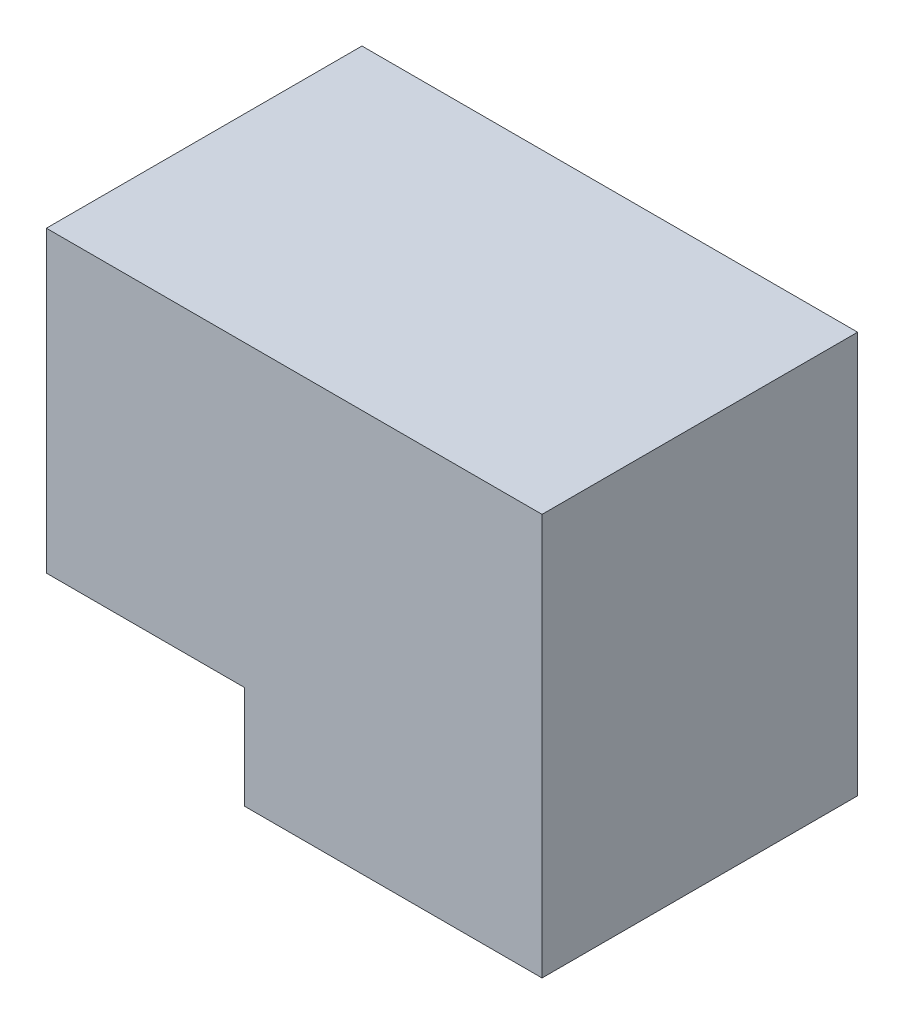
ISO-10303-21;
HEADER;
FILE_DESCRIPTION(('STEP AP214'),'2;1');
FILE_NAME('part.step','',(''),(''),'','','');
FILE_SCHEMA(('AUTOMOTIVE_DESIGN { 1 0 10303 214 1 1 1 1 }'));
ENDSEC;
DATA;
#1=APPLICATION_CONTEXT('core data for automotive mechanical design processes');
#2=APPLICATION_PROTOCOL_DEFINITION('international standard','automotive_design',2000,#1);
#3=PRODUCT_CONTEXT('',#1,'mechanical');
#4=PRODUCT('Part','Part','',(#3));
#5=PRODUCT_RELATED_PRODUCT_CATEGORY('part','',(#4));
#6=PRODUCT_DEFINITION_FORMATION('','',#4);
#7=PRODUCT_DEFINITION_CONTEXT('part definition',#1,'design');
#8=PRODUCT_DEFINITION('design','',#6,#7);
#9=PRODUCT_DEFINITION_SHAPE('','',#8);
#10=(LENGTH_UNIT() NAMED_UNIT(*) SI_UNIT(.MILLI.,.METRE.));
#11=(NAMED_UNIT(*) PLANE_ANGLE_UNIT() SI_UNIT($,.RADIAN.));
#12=(NAMED_UNIT(*) SI_UNIT($,.STERADIAN.) SOLID_ANGLE_UNIT());
#13=UNCERTAINTY_MEASURE_WITH_UNIT(LENGTH_MEASURE(1.E-05),#10,'distance_accuracy_value','');
#14=(GEOMETRIC_REPRESENTATION_CONTEXT(3) GLOBAL_UNCERTAINTY_ASSIGNED_CONTEXT((#13)) GLOBAL_UNIT_ASSIGNED_CONTEXT((#10,
#11,#12)) REPRESENTATION_CONTEXT('',''));
#15=CARTESIAN_POINT('',(0.,0.,0.));
#16=DIRECTION('',(0.,0.,1.));
#17=DIRECTION('',(1.,0.,0.));
#18=AXIS2_PLACEMENT_3D('',#15,#16,#17);
#19=CARTESIAN_POINT('',(0.,28.4005429039134,30.));
#20=DIRECTION('',(1.,0.,0.));
#21=DIRECTION('',(0.,0.,-1.));
#22=AXIS2_PLACEMENT_3D('',#19,#20,#21);
#23=PLANE('',#22);
#24=DIRECTION('',(0.,-1.,0.));
#25=VECTOR('',#24,1.);
#26=CARTESIAN_POINT('',(0.,28.4005429039134,0.));
#27=LINE('',#26,#25);
#28=CARTESIAN_POINT('',(0.,28.4005429039134,0.));
#29=VERTEX_POINT('',#28);
#30=CARTESIAN_POINT('',(0.,0.,0.));
#31=VERTEX_POINT('',#30);
#32=EDGE_CURVE('E117',#29,#31,#27,.T.);
#33=ORIENTED_EDGE('',*,*,#32,.T.);
#34=DIRECTION('',(0.,0.,-1.));
#35=VECTOR('',#34,1.);
#36=CARTESIAN_POINT('',(0.,0.,30.));
#37=LINE('',#36,#35);
#38=CARTESIAN_POINT('',(0.,0.,30.));
#39=VERTEX_POINT('',#38);
#40=EDGE_CURVE('E11',#39,#31,#37,.T.);
#41=ORIENTED_EDGE('',*,*,#40,.F.);
#42=DIRECTION('',(0.,-1.,0.));
#43=VECTOR('',#42,1.);
#44=CARTESIAN_POINT('',(0.,28.4005429039134,30.));
#45=LINE('',#44,#43);
#46=CARTESIAN_POINT('',(0.,28.4005429039134,30.));
#47=VERTEX_POINT('',#46);
#48=EDGE_CURVE('E127',#47,#39,#45,.T.);
#49=ORIENTED_EDGE('',*,*,#48,.F.);
#50=DIRECTION('',(0.,0.,-1.));
#51=VECTOR('',#50,1.);
#52=CARTESIAN_POINT('',(0.,28.4005429039134,30.));
#53=LINE('',#52,#51);
#54=EDGE_CURVE('E113',#47,#29,#53,.T.);
#55=ORIENTED_EDGE('',*,*,#54,.T.);
#56=EDGE_LOOP('',(#33,#41,#49,#55));
#57=FACE_BOUND('',#56,.T.);
#58=ADVANCED_FACE('F33',(#57),#23,.F.);
#59=CARTESIAN_POINT('',(0.,0.,30.));
#60=DIRECTION('',(0.,1.,0.));
#61=DIRECTION('',(0.,0.,1.));
#62=AXIS2_PLACEMENT_3D('',#59,#60,#61);
#63=PLANE('',#62);
#64=DIRECTION('',(1.,0.,0.));
#65=VECTOR('',#64,1.);
#66=CARTESIAN_POINT('',(0.,0.,0.));
#67=LINE('',#66,#65);
#68=CARTESIAN_POINT('',(18.8119351710809,0.,0.));
#69=VERTEX_POINT('',#68);
#70=EDGE_CURVE('E120',#31,#69,#67,.T.);
#71=ORIENTED_EDGE('',*,*,#70,.T.);
#72=DIRECTION('',(0.,0.,-1.));
#73=VECTOR('',#72,1.);
#74=CARTESIAN_POINT('',(18.8119351710809,0.,30.));
#75=LINE('',#74,#73);
#76=CARTESIAN_POINT('',(18.8119351710809,0.,30.));
#77=VERTEX_POINT('',#76);
#78=EDGE_CURVE('E41',#77,#69,#75,.T.);
#79=ORIENTED_EDGE('',*,*,#78,.F.);
#80=DIRECTION('',(1.,0.,0.));
#81=VECTOR('',#80,1.);
#82=CARTESIAN_POINT('',(0.,0.,30.));
#83=LINE('',#82,#81);
#84=EDGE_CURVE('E86',#39,#77,#83,.T.);
#85=ORIENTED_EDGE('',*,*,#84,.F.);
#86=ORIENTED_EDGE('',*,*,#40,.T.);
#87=EDGE_LOOP('',(#71,#79,#85,#86));
#88=FACE_BOUND('',#87,.T.);
#89=ADVANCED_FACE('F151',(#88),#63,.F.);
#90=CARTESIAN_POINT('',(18.8119351710809,0.,30.));
#91=DIRECTION('',(1.,0.,0.));
#92=DIRECTION('',(0.,0.,-1.));
#93=AXIS2_PLACEMENT_3D('',#90,#91,#92);
#94=PLANE('',#93);
#95=DIRECTION('',(0.,-1.,0.));
#96=VECTOR('',#95,1.);
#97=CARTESIAN_POINT('',(18.8119351710809,0.,0.));
#98=LINE('',#97,#96);
#99=CARTESIAN_POINT('',(18.8119351710809,-9.77124788012457,0.));
#100=VERTEX_POINT('',#99);
#101=EDGE_CURVE('E122',#69,#100,#98,.T.);
#102=ORIENTED_EDGE('',*,*,#101,.T.);
#103=DIRECTION('',(0.,0.,-1.));
#104=VECTOR('',#103,1.);
#105=CARTESIAN_POINT('',(18.8119351710809,-9.77124788012457,30.));
#106=LINE('',#105,#104);
#107=CARTESIAN_POINT('',(18.8119351710809,-9.77124788012457,30.));
#108=VERTEX_POINT('',#107);
#109=EDGE_CURVE('E108',#108,#100,#106,.T.);
#110=ORIENTED_EDGE('',*,*,#109,.F.);
#111=DIRECTION('',(0.,-1.,0.));
#112=VECTOR('',#111,1.);
#113=CARTESIAN_POINT('',(18.8119351710809,0.,30.));
#114=LINE('',#113,#112);
#115=EDGE_CURVE('E99',#77,#108,#114,.T.);
#116=ORIENTED_EDGE('',*,*,#115,.F.);
#117=ORIENTED_EDGE('',*,*,#78,.T.);
#118=EDGE_LOOP('',(#102,#110,#116,#117));
#119=FACE_BOUND('',#118,.T.);
#120=ADVANCED_FACE('F133',(#119),#94,.F.);
#121=CARTESIAN_POINT('',(18.8119351710809,-9.77124788012457,30.));
#122=DIRECTION('',(0.,1.,0.));
#123=DIRECTION('',(0.,0.,1.));
#124=AXIS2_PLACEMENT_3D('',#121,#122,#123);
#125=PLANE('',#124);
#126=DIRECTION('',(1.,0.,0.));
#127=VECTOR('',#126,1.);
#128=CARTESIAN_POINT('',(18.8119351710809,-9.77124788012457,0.));
#129=LINE('',#128,#127);
#130=CARTESIAN_POINT('',(47.1211580013483,-9.77124788012457,0.));
#131=VERTEX_POINT('',#130);
#132=EDGE_CURVE('E107',#100,#131,#129,.T.);
#133=ORIENTED_EDGE('',*,*,#132,.T.);
#134=DIRECTION('',(0.,0.,-1.));
#135=VECTOR('',#134,1.);
#136=CARTESIAN_POINT('',(47.1211580013483,-9.77124788012457,30.));
#137=LINE('',#136,#135);
#138=CARTESIAN_POINT('',(47.1211580013483,-9.77124788012457,30.));
#139=VERTEX_POINT('',#138);
#140=EDGE_CURVE('E104',#139,#131,#137,.T.);
#141=ORIENTED_EDGE('',*,*,#140,.F.);
#142=DIRECTION('',(1.,0.,0.));
#143=VECTOR('',#142,1.);
#144=CARTESIAN_POINT('',(18.8119351710809,-9.77124788012457,30.));
#145=LINE('',#144,#143);
#146=EDGE_CURVE('E93',#108,#139,#145,.T.);
#147=ORIENTED_EDGE('',*,*,#146,.F.);
#148=ORIENTED_EDGE('',*,*,#109,.T.);
#149=EDGE_LOOP('',(#133,#141,#147,#148));
#150=FACE_BOUND('',#149,.T.);
#151=ADVANCED_FACE('F105',(#150),#125,.F.);
#152=CARTESIAN_POINT('',(47.1211580013483,-9.77124788012457,30.));
#153=DIRECTION('',(-1.,0.,0.));
#154=DIRECTION('',(0.,0.,1.));
#155=AXIS2_PLACEMENT_3D('',#152,#153,#154);
#156=PLANE('',#155);
#157=DIRECTION('',(0.,1.,0.));
#158=VECTOR('',#157,1.);
#159=CARTESIAN_POINT('',(47.1211580013483,-9.77124788012457,0.));
#160=LINE('',#159,#158);
#161=CARTESIAN_POINT('',(47.1211580013483,28.4005429039134,0.));
#162=VERTEX_POINT('',#161);
#163=EDGE_CURVE('E72',#131,#162,#160,.T.);
#164=ORIENTED_EDGE('',*,*,#163,.T.);
#165=DIRECTION('',(0.,0.,-1.));
#166=VECTOR('',#165,1.);
#167=CARTESIAN_POINT('',(47.1211580013483,28.4005429039134,30.));
#168=LINE('',#167,#166);
#169=CARTESIAN_POINT('',(47.1211580013483,28.4005429039134,30.));
#170=VERTEX_POINT('',#169);
#171=EDGE_CURVE('E109',#170,#162,#168,.T.);
#172=ORIENTED_EDGE('',*,*,#171,.F.);
#173=DIRECTION('',(0.,1.,0.));
#174=VECTOR('',#173,1.);
#175=CARTESIAN_POINT('',(47.1211580013483,-9.77124788012457,30.));
#176=LINE('',#175,#174);
#177=EDGE_CURVE('E97',#139,#170,#176,.T.);
#178=ORIENTED_EDGE('',*,*,#177,.F.);
#179=ORIENTED_EDGE('',*,*,#140,.T.);
#180=EDGE_LOOP('',(#164,#172,#178,#179));
#181=FACE_BOUND('',#180,.T.);
#182=ADVANCED_FACE('F111',(#181),#156,.F.);
#183=CARTESIAN_POINT('',(47.1211580013483,28.4005429039134,30.));
#184=DIRECTION('',(0.,-1.,0.));
#185=DIRECTION('',(0.,0.,-1.));
#186=AXIS2_PLACEMENT_3D('',#183,#184,#185);
#187=PLANE('',#186);
#188=DIRECTION('',(-1.,0.,0.));
#189=VECTOR('',#188,1.);
#190=CARTESIAN_POINT('',(47.1211580013483,28.4005429039134,0.));
#191=LINE('',#190,#189);
#192=EDGE_CURVE('E78',#162,#29,#191,.T.);
#193=ORIENTED_EDGE('',*,*,#192,.T.);
#194=ORIENTED_EDGE('',*,*,#54,.F.);
#195=DIRECTION('',(-1.,0.,0.));
#196=VECTOR('',#195,1.);
#197=CARTESIAN_POINT('',(47.1211580013483,28.4005429039134,30.));
#198=LINE('',#197,#196);
#199=EDGE_CURVE('E49',#170,#47,#198,.T.);
#200=ORIENTED_EDGE('',*,*,#199,.F.);
#201=ORIENTED_EDGE('',*,*,#171,.T.);
#202=EDGE_LOOP('',(#193,#194,#200,#201));
#203=FACE_BOUND('',#202,.T.);
#204=ADVANCED_FACE('F140',(#203),#187,.F.);
#205=CARTESIAN_POINT('',(0.,0.,30.));
#206=DIRECTION('',(0.,0.,1.));
#207=DIRECTION('',(1.,0.,0.));
#208=AXIS2_PLACEMENT_3D('',#205,#206,#207);
#209=PLANE('',#208);
#210=ORIENTED_EDGE('',*,*,#48,.T.);
#211=ORIENTED_EDGE('',*,*,#84,.T.);
#212=ORIENTED_EDGE('',*,*,#115,.T.);
#213=ORIENTED_EDGE('',*,*,#146,.T.);
#214=ORIENTED_EDGE('',*,*,#177,.T.);
#215=ORIENTED_EDGE('',*,*,#199,.T.);
#216=EDGE_LOOP('',(#210,#211,#212,#213,#214,#215));
#217=FACE_BOUND('',#216,.T.);
#218=ADVANCED_FACE('F95',(#217),#209,.T.);
#219=CARTESIAN_POINT('',(0.,0.,0.));
#220=DIRECTION('',(0.,0.,1.));
#221=DIRECTION('',(1.,0.,0.));
#222=AXIS2_PLACEMENT_3D('',#219,#220,#221);
#223=PLANE('',#222);
#224=ORIENTED_EDGE('',*,*,#32,.F.);
#225=ORIENTED_EDGE('',*,*,#192,.F.);
#226=ORIENTED_EDGE('',*,*,#163,.F.);
#227=ORIENTED_EDGE('',*,*,#132,.F.);
#228=ORIENTED_EDGE('',*,*,#101,.F.);
#229=ORIENTED_EDGE('',*,*,#70,.F.);
#230=EDGE_LOOP('',(#224,#225,#226,#227,#228,#229));
#231=FACE_BOUND('',#230,.T.);
#232=ADVANCED_FACE('F136',(#231),#223,.F.);
#233=CLOSED_SHELL('',(#58,#89,#120,#151,#182,#204,#218,#232));
#234=MANIFOLD_SOLID_BREP('B2',#233);
#235=ADVANCED_BREP_SHAPE_REPRESENTATION('',(#18,#234),#14);
#236=SHAPE_DEFINITION_REPRESENTATION(#9,#235);
ENDSEC;
END-ISO-10303-21;
